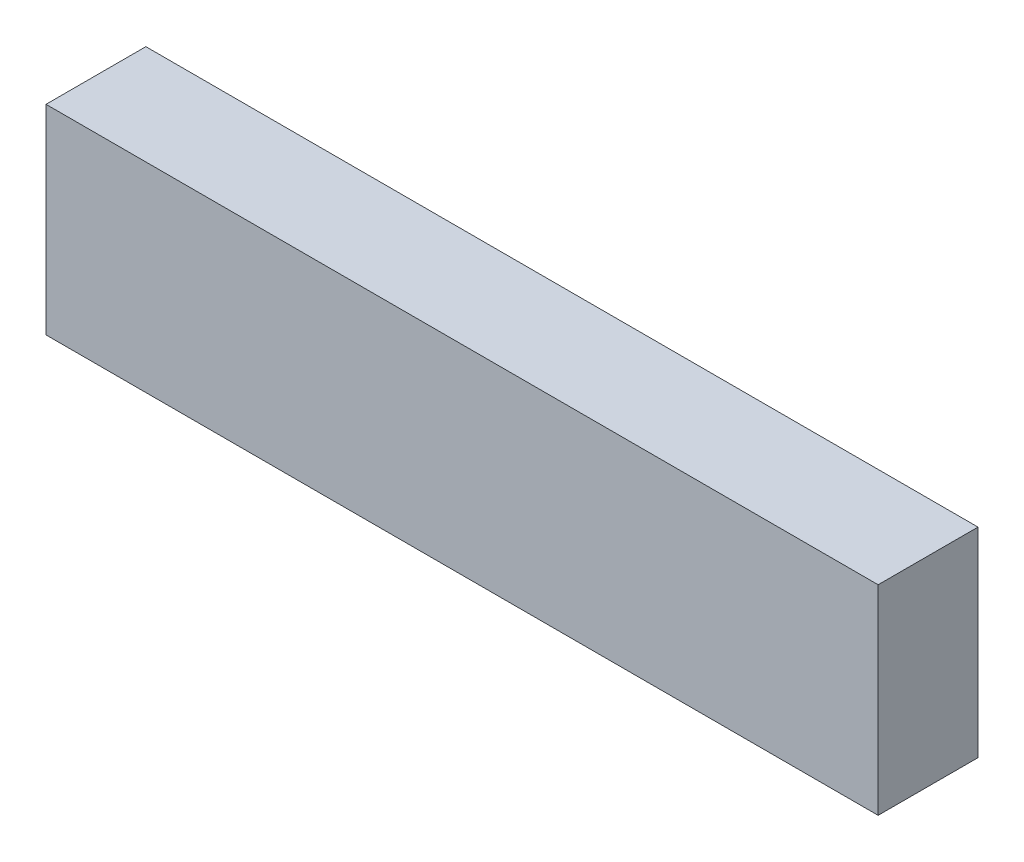
ISO-10303-21;
HEADER;
FILE_DESCRIPTION(('STEP AP214'),'2;1');
FILE_NAME('part.step','',(''),(''),'','','');
FILE_SCHEMA(('AUTOMOTIVE_DESIGN { 1 0 10303 214 1 1 1 1 }'));
ENDSEC;
DATA;
#1=APPLICATION_CONTEXT('core data for automotive mechanical design processes');
#2=APPLICATION_PROTOCOL_DEFINITION('international standard','automotive_design',2000,#1);
#3=PRODUCT_CONTEXT('',#1,'mechanical');
#4=PRODUCT('Part','Part','',(#3));
#5=PRODUCT_RELATED_PRODUCT_CATEGORY('part','',(#4));
#6=PRODUCT_DEFINITION_FORMATION('','',#4);
#7=PRODUCT_DEFINITION_CONTEXT('part definition',#1,'design');
#8=PRODUCT_DEFINITION('design','',#6,#7);
#9=PRODUCT_DEFINITION_SHAPE('','',#8);
#10=(LENGTH_UNIT() NAMED_UNIT(*) SI_UNIT(.MILLI.,.METRE.));
#11=(NAMED_UNIT(*) PLANE_ANGLE_UNIT() SI_UNIT($,.RADIAN.));
#12=(NAMED_UNIT(*) SI_UNIT($,.STERADIAN.) SOLID_ANGLE_UNIT());
#13=UNCERTAINTY_MEASURE_WITH_UNIT(LENGTH_MEASURE(1.E-05),#10,'distance_accuracy_value','');
#14=(GEOMETRIC_REPRESENTATION_CONTEXT(3) GLOBAL_UNCERTAINTY_ASSIGNED_CONTEXT((#13)) GLOBAL_UNIT_ASSIGNED_CONTEXT((#10,
#11,#12)) REPRESENTATION_CONTEXT('',''));
#15=CARTESIAN_POINT('',(0.,0.,0.));
#16=DIRECTION('',(0.,0.,1.));
#17=DIRECTION('',(1.,0.,0.));
#18=AXIS2_PLACEMENT_3D('',#15,#16,#17);
#19=CARTESIAN_POINT('',(62.5,15.,15.));
#20=DIRECTION('',(-1.,0.,0.));
#21=DIRECTION('',(0.,-1.,0.));
#22=AXIS2_PLACEMENT_3D('',#19,#20,#21);
#23=PLANE('',#22);
#24=DIRECTION('',(0.,1.,0.));
#25=VECTOR('',#24,1.);
#26=CARTESIAN_POINT('',(62.5,15.,0.));
#27=LINE('',#26,#25);
#28=CARTESIAN_POINT('',(62.5,-15.,0.));
#29=VERTEX_POINT('',#28);
#30=CARTESIAN_POINT('',(62.5,15.,0.));
#31=VERTEX_POINT('',#30);
#32=EDGE_CURVE('E107',#29,#31,#27,.T.);
#33=ORIENTED_EDGE('',*,*,#32,.T.);
#34=DIRECTION('',(0.,0.,-1.));
#35=VECTOR('',#34,1.);
#36=CARTESIAN_POINT('',(62.5,15.,15.));
#37=LINE('',#36,#35);
#38=CARTESIAN_POINT('',(62.5,15.,15.));
#39=VERTEX_POINT('',#38);
#40=EDGE_CURVE('E11',#39,#31,#37,.T.);
#41=ORIENTED_EDGE('',*,*,#40,.F.);
#42=DIRECTION('',(0.,1.,0.));
#43=VECTOR('',#42,1.);
#44=CARTESIAN_POINT('',(62.5,15.,15.));
#45=LINE('',#44,#43);
#46=CARTESIAN_POINT('',(62.5,-15.,15.));
#47=VERTEX_POINT('',#46);
#48=EDGE_CURVE('E91',#47,#39,#45,.T.);
#49=ORIENTED_EDGE('',*,*,#48,.F.);
#50=DIRECTION('',(0.,0.,-1.));
#51=VECTOR('',#50,1.);
#52=CARTESIAN_POINT('',(62.5,-15.,15.));
#53=LINE('',#52,#51);
#54=EDGE_CURVE('E103',#47,#29,#53,.T.);
#55=ORIENTED_EDGE('',*,*,#54,.T.);
#56=EDGE_LOOP('',(#33,#41,#49,#55));
#57=FACE_BOUND('',#56,.T.);
#58=ADVANCED_FACE('F39',(#57),#23,.F.);
#59=CARTESIAN_POINT('',(-62.5,15.,15.));
#60=DIRECTION('',(0.,-1.,0.));
#61=DIRECTION('',(0.,0.,-1.));
#62=AXIS2_PLACEMENT_3D('',#59,#60,#61);
#63=PLANE('',#62);
#64=DIRECTION('',(-1.,0.,0.));
#65=VECTOR('',#64,1.);
#66=CARTESIAN_POINT('',(-62.5,15.,0.));
#67=LINE('',#66,#65);
#68=CARTESIAN_POINT('',(-62.5,15.,0.));
#69=VERTEX_POINT('',#68);
#70=EDGE_CURVE('E96',#31,#69,#67,.T.);
#71=ORIENTED_EDGE('',*,*,#70,.T.);
#72=DIRECTION('',(0.,0.,-1.));
#73=VECTOR('',#72,1.);
#74=CARTESIAN_POINT('',(-62.5,15.,15.));
#75=LINE('',#74,#73);
#76=CARTESIAN_POINT('',(-62.5,15.,15.));
#77=VERTEX_POINT('',#76);
#78=EDGE_CURVE('E48',#77,#69,#75,.T.);
#79=ORIENTED_EDGE('',*,*,#78,.F.);
#80=DIRECTION('',(-1.,0.,0.));
#81=VECTOR('',#80,1.);
#82=CARTESIAN_POINT('',(-62.5,15.,15.));
#83=LINE('',#82,#81);
#84=EDGE_CURVE('E86',#39,#77,#83,.T.);
#85=ORIENTED_EDGE('',*,*,#84,.F.);
#86=ORIENTED_EDGE('',*,*,#40,.T.);
#87=EDGE_LOOP('',(#71,#79,#85,#86));
#88=FACE_BOUND('',#87,.T.);
#89=ADVANCED_FACE('F95',(#88),#63,.F.);
#90=CARTESIAN_POINT('',(-62.5,15.,15.));
#91=DIRECTION('',(1.,0.,0.));
#92=DIRECTION('',(0.,1.,0.));
#93=AXIS2_PLACEMENT_3D('',#90,#91,#92);
#94=PLANE('',#93);
#95=DIRECTION('',(0.,-1.,0.));
#96=VECTOR('',#95,1.);
#97=CARTESIAN_POINT('',(-62.5,15.,0.));
#98=LINE('',#97,#96);
#99=CARTESIAN_POINT('',(-62.5,-15.,0.));
#100=VERTEX_POINT('',#99);
#101=EDGE_CURVE('E73',#69,#100,#98,.T.);
#102=ORIENTED_EDGE('',*,*,#101,.T.);
#103=DIRECTION('',(0.,0.,-1.));
#104=VECTOR('',#103,1.);
#105=CARTESIAN_POINT('',(-62.5,-15.,15.));
#106=LINE('',#105,#104);
#107=CARTESIAN_POINT('',(-62.5,-15.,15.));
#108=VERTEX_POINT('',#107);
#109=EDGE_CURVE('E98',#108,#100,#106,.T.);
#110=ORIENTED_EDGE('',*,*,#109,.F.);
#111=DIRECTION('',(0.,-1.,0.));
#112=VECTOR('',#111,1.);
#113=CARTESIAN_POINT('',(-62.5,15.,15.));
#114=LINE('',#113,#112);
#115=EDGE_CURVE('E89',#77,#108,#114,.T.);
#116=ORIENTED_EDGE('',*,*,#115,.F.);
#117=ORIENTED_EDGE('',*,*,#78,.T.);
#118=EDGE_LOOP('',(#102,#110,#116,#117));
#119=FACE_BOUND('',#118,.T.);
#120=ADVANCED_FACE('F99',(#119),#94,.F.);
#121=CARTESIAN_POINT('',(-62.5,-15.,15.));
#122=DIRECTION('',(0.,1.,0.));
#123=DIRECTION('',(0.,0.,1.));
#124=AXIS2_PLACEMENT_3D('',#121,#122,#123);
#125=PLANE('',#124);
#126=DIRECTION('',(1.,0.,0.));
#127=VECTOR('',#126,1.);
#128=CARTESIAN_POINT('',(-62.5,-15.,0.));
#129=LINE('',#128,#127);
#130=EDGE_CURVE('E79',#100,#29,#129,.T.);
#131=ORIENTED_EDGE('',*,*,#130,.T.);
#132=ORIENTED_EDGE('',*,*,#54,.F.);
#133=DIRECTION('',(1.,0.,0.));
#134=VECTOR('',#133,1.);
#135=CARTESIAN_POINT('',(-62.5,-15.,15.));
#136=LINE('',#135,#134);
#137=EDGE_CURVE('E56',#108,#47,#136,.T.);
#138=ORIENTED_EDGE('',*,*,#137,.F.);
#139=ORIENTED_EDGE('',*,*,#109,.T.);
#140=EDGE_LOOP('',(#131,#132,#138,#139));
#141=FACE_BOUND('',#140,.T.);
#142=ADVANCED_FACE('F120',(#141),#125,.F.);
#143=CARTESIAN_POINT('',(0.,0.,15.));
#144=DIRECTION('',(0.,0.,1.));
#145=DIRECTION('',(1.,0.,0.));
#146=AXIS2_PLACEMENT_3D('',#143,#144,#145);
#147=PLANE('',#146);
#148=ORIENTED_EDGE('',*,*,#48,.T.);
#149=ORIENTED_EDGE('',*,*,#84,.T.);
#150=ORIENTED_EDGE('',*,*,#115,.T.);
#151=ORIENTED_EDGE('',*,*,#137,.T.);
#152=EDGE_LOOP('',(#148,#149,#150,#151));
#153=FACE_BOUND('',#152,.T.);
#154=ADVANCED_FACE('F87',(#153),#147,.T.);
#155=CARTESIAN_POINT('',(0.,0.,0.));
#156=DIRECTION('',(0.,0.,1.));
#157=DIRECTION('',(1.,0.,0.));
#158=AXIS2_PLACEMENT_3D('',#155,#156,#157);
#159=PLANE('',#158);
#160=ORIENTED_EDGE('',*,*,#32,.F.);
#161=ORIENTED_EDGE('',*,*,#130,.F.);
#162=ORIENTED_EDGE('',*,*,#101,.F.);
#163=ORIENTED_EDGE('',*,*,#70,.F.);
#164=EDGE_LOOP('',(#160,#161,#162,#163));
#165=FACE_BOUND('',#164,.T.);
#166=ADVANCED_FACE('F123',(#165),#159,.F.);
#167=CLOSED_SHELL('',(#58,#89,#120,#142,#154,#166));
#168=MANIFOLD_SOLID_BREP('B2',#167);
#169=ADVANCED_BREP_SHAPE_REPRESENTATION('',(#18,#168),#14);
#170=SHAPE_DEFINITION_REPRESENTATION(#9,#169);
ENDSEC;
END-ISO-10303-21;
